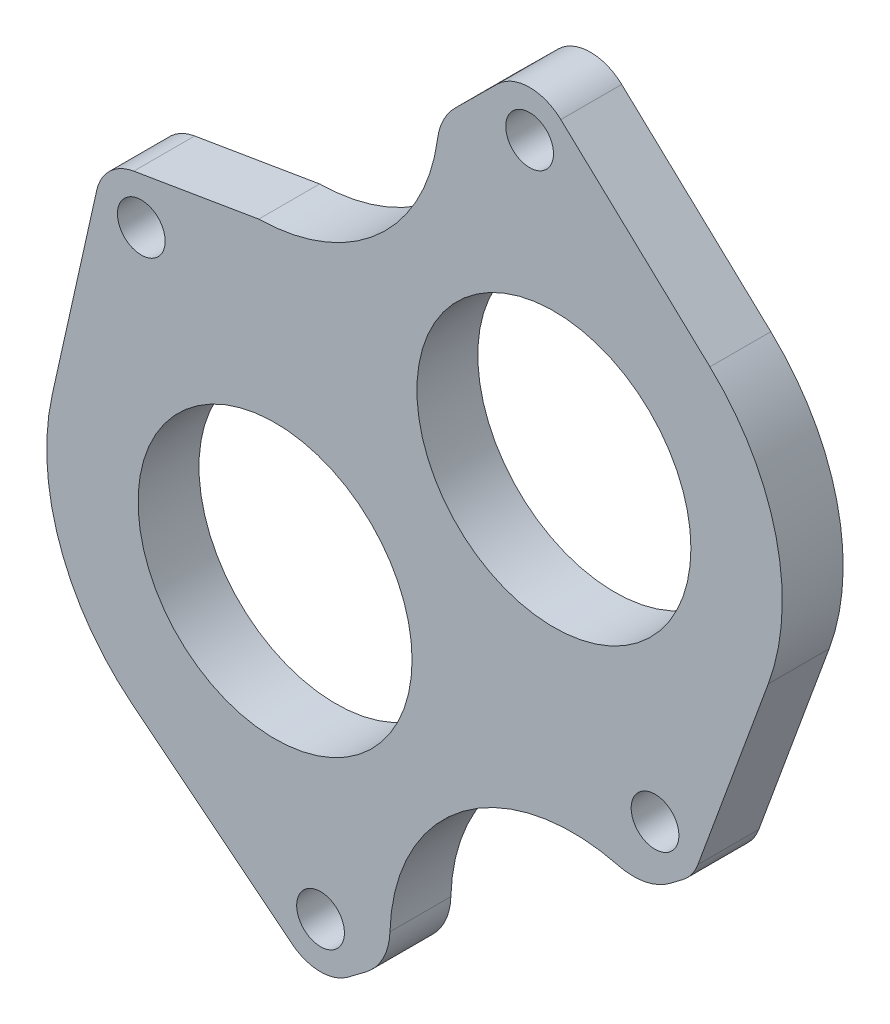
ISO-10303-21;
HEADER;
FILE_DESCRIPTION(('STEP AP214'),'2;1');
FILE_NAME('part.step','',(''),(''),'','','');
FILE_SCHEMA(('AUTOMOTIVE_DESIGN { 1 0 10303 214 1 1 1 1 }'));
ENDSEC;
DATA;
#1=APPLICATION_CONTEXT('core data for automotive mechanical design processes');
#2=APPLICATION_PROTOCOL_DEFINITION('international standard','automotive_design',2000,#1);
#3=PRODUCT_CONTEXT('',#1,'mechanical');
#4=PRODUCT('Part','Part','',(#3));
#5=PRODUCT_RELATED_PRODUCT_CATEGORY('part','',(#4));
#6=PRODUCT_DEFINITION_FORMATION('','',#4);
#7=PRODUCT_DEFINITION_CONTEXT('part definition',#1,'design');
#8=PRODUCT_DEFINITION('design','',#6,#7);
#9=PRODUCT_DEFINITION_SHAPE('','',#8);
#10=(LENGTH_UNIT() NAMED_UNIT(*) SI_UNIT(.MILLI.,.METRE.));
#11=(NAMED_UNIT(*) PLANE_ANGLE_UNIT() SI_UNIT($,.RADIAN.));
#12=(NAMED_UNIT(*) SI_UNIT($,.STERADIAN.) SOLID_ANGLE_UNIT());
#13=UNCERTAINTY_MEASURE_WITH_UNIT(LENGTH_MEASURE(1.E-05),#10,'distance_accuracy_value','');
#14=(GEOMETRIC_REPRESENTATION_CONTEXT(3) GLOBAL_UNCERTAINTY_ASSIGNED_CONTEXT((#13)) GLOBAL_UNIT_ASSIGNED_CONTEXT((#10,
#11,#12)) REPRESENTATION_CONTEXT('',''));
#15=CARTESIAN_POINT('',(0.,0.,0.));
#16=DIRECTION('',(0.,0.,1.));
#17=DIRECTION('',(1.,0.,0.));
#18=AXIS2_PLACEMENT_3D('',#15,#16,#17);
#19=CARTESIAN_POINT('',(363.409853814933,255.603713269691,6.35));
#20=DIRECTION('',(0.,0.,1.));
#21=DIRECTION('',(1.,0.,0.));
#22=AXIS2_PLACEMENT_3D('',#19,#20,#21);
#23=PLANE('',#22);
#24=CARTESIAN_POINT('',(339.073186785204,202.806598082301,6.35));
#25=DIRECTION('',(0.,0.,1.));
#26=DIRECTION('',(1.,0.,0.));
#27=AXIS2_PLACEMENT_3D('',#24,#25,#26);
#28=CIRCLE('',#27,2.48920000000001);
#29=CARTESIAN_POINT('',(341.562386785204,202.806598082301,6.35));
#30=VERTEX_POINT('',#29);
#31=EDGE_CURVE('E351',#30,#30,#28,.T.);
#32=ORIENTED_EDGE('',*,*,#31,.F.);
#33=EDGE_LOOP('',(#32));
#34=FACE_BOUND('',#33,.T.);
#35=CARTESIAN_POINT('',(360.875584674336,284.066111357747,6.35));
#36=DIRECTION('',(0.,0.,1.));
#37=DIRECTION('',(1.,0.,0.));
#38=AXIS2_PLACEMENT_3D('',#35,#36,#37);
#39=CIRCLE('',#38,2.48920000000001);
#40=CARTESIAN_POINT('',(363.364784674336,284.066111357747,6.35));
#41=VERTEX_POINT('',#40);
#42=EDGE_CURVE('E339',#41,#41,#39,.T.);
#43=ORIENTED_EDGE('',*,*,#42,.F.);
#44=EDGE_LOOP('',(#43));
#45=FACE_BOUND('',#44,.T.);
#46=CARTESIAN_POINT('',(320.381847871192,255.924118881008,6.35));
#47=DIRECTION('',(0.,0.,1.));
#48=DIRECTION('',(1.,0.,0.));
#49=AXIS2_PLACEMENT_3D('',#46,#47,#48);
#50=CIRCLE('',#49,2.48920000000001);
#51=CARTESIAN_POINT('',(322.871047871192,255.924118881008,6.35));
#52=VERTEX_POINT('',#51);
#53=EDGE_CURVE('E305',#52,#52,#50,.T.);
#54=ORIENTED_EDGE('',*,*,#53,.F.);
#55=EDGE_LOOP('',(#54));
#56=FACE_BOUND('',#55,.T.);
#57=CARTESIAN_POINT('',(365.35511748156,204.733869501161,6.35));
#58=DIRECTION('',(0.,0.,-1.));
#59=DIRECTION('',(-1.,0.,0.));
#60=AXIS2_PLACEMENT_3D('',#57,#58,#59);
#61=CIRCLE('',#60,19.05);
#62=CARTESIAN_POINT('',(346.312999091938,205.281799456218,6.35));
#63=VERTEX_POINT('',#62);
#64=CARTESIAN_POINT('',(370.108013128838,223.18142985385,6.35));
#65=VERTEX_POINT('',#64);
#66=EDGE_CURVE('E311',#63,#65,#61,.T.);
#67=ORIENTED_EDGE('',*,*,#66,.T.);
#68=CARTESIAN_POINT('',(371.692311677931,229.330616638079,6.35));
#69=DIRECTION('',(0.,0.,1.));
#70=DIRECTION('',(1.,0.,0.));
#71=AXIS2_PLACEMENT_3D('',#68,#69,#70);
#72=CIRCLE('',#71,6.35);
#73=CARTESIAN_POINT('',(375.509592032349,224.256085064054,6.35));
#74=VERTEX_POINT('',#73);
#75=EDGE_CURVE('E217',#65,#74,#72,.T.);
#76=ORIENTED_EDGE('',*,*,#75,.T.);
#77=DIRECTION('',(0.799138830555082,0.601146512506773,0.));
#78=VECTOR('',#77,1.);
#79=CARTESIAN_POINT('',(376.816438514688,225.239151053595,6.35));
#80=LINE('',#79,#78);
#81=CARTESIAN_POINT('',(376.816438514688,225.239151053595,6.35));
#82=VERTEX_POINT('',#81);
#83=EDGE_CURVE('E309',#74,#82,#80,.T.);
#84=ORIENTED_EDGE('',*,*,#83,.T.);
#85=CARTESIAN_POINT('',(373.953478248874,229.045049734113,6.35));
#86=DIRECTION('',(0.,0.,1.));
#87=DIRECTION('',(-1.,0.,0.));
#88=AXIS2_PLACEMENT_3D('',#85,#86,#87);
#89=CIRCLE('',#88,4.76249999999999);
#90=CARTESIAN_POINT('',(378.42426857804,227.4038793948,6.35));
#91=VERTEX_POINT('',#90);
#92=EDGE_CURVE('E307',#82,#91,#89,.T.);
#93=ORIENTED_EDGE('',*,*,#92,.T.);
#94=DIRECTION('',(0.344602695918755,0.938748625546544,0.));
#95=VECTOR('',#94,1.);
#96=CARTESIAN_POINT('',(378.42426857804,227.4038793948,6.35));
#97=LINE('',#96,#95);
#98=CARTESIAN_POINT('',(385.76380546076,247.397861573125,6.35));
#99=VERTEX_POINT('',#98);
#100=EDGE_CURVE('E186',#91,#99,#97,.T.);
#101=ORIENTED_EDGE('',*,*,#100,.T.);
#102=CARTESIAN_POINT('',(363.409853814933,255.603713269691,6.35));
#103=DIRECTION('',(0.,0.,1.));
#104=DIRECTION('',(1.,0.,0.));
#105=AXIS2_PLACEMENT_3D('',#102,#103,#104);
#106=CIRCLE('',#105,23.8125000000001);
#107=CARTESIAN_POINT('',(379.680775661145,272.990267227404,6.35));
#108=VERTEX_POINT('',#107);
#109=EDGE_CURVE('E180',#99,#108,#106,.T.);
#110=ORIENTED_EDGE('',*,*,#109,.T.);
#111=DIRECTION('',(-0.730143998224189,0.683293305877641,0.));
#112=VECTOR('',#111,1.);
#113=CARTESIAN_POINT('',(379.680775661145,272.990267227404,6.35));
#114=LINE('',#113,#112);
#115=CARTESIAN_POINT('',(364.129769043579,287.54342214929,6.35));
#116=VERTEX_POINT('',#115);
#117=EDGE_CURVE('E170',#108,#116,#114,.T.);
#118=ORIENTED_EDGE('',*,*,#117,.T.);
#119=CARTESIAN_POINT('',(360.875584674336,284.066111357747,6.35));
#120=DIRECTION('',(0.,0.,1.));
#121=DIRECTION('',(1.,0.,0.));
#122=AXIS2_PLACEMENT_3D('',#119,#120,#121);
#123=CIRCLE('',#122,4.76250000000002);
#124=CARTESIAN_POINT('',(357.525140617793,287.450772474311,6.35));
#125=VERTEX_POINT('',#124);
#126=EDGE_CURVE('E179',#116,#125,#123,.T.);
#127=ORIENTED_EDGE('',*,*,#126,.T.);
#128=DIRECTION('',(-0.71068999822854,-0.703505313709795,0.));
#129=VECTOR('',#128,1.);
#130=CARTESIAN_POINT('',(357.525140617793,287.450772474311,6.35));
#131=LINE('',#130,#129);
#132=CARTESIAN_POINT('',(353.104578853054,283.074900154695,6.35));
#133=VERTEX_POINT('',#132);
#134=EDGE_CURVE('E298',#125,#133,#131,.T.);
#135=ORIENTED_EDGE('',*,*,#134,.T.);
#136=CARTESIAN_POINT('',(357.571837595111,278.562018665943,6.35));
#137=DIRECTION('',(0.,0.,1.));
#138=DIRECTION('',(1.,0.,0.));
#139=AXIS2_PLACEMENT_3D('',#136,#137,#138);
#140=CIRCLE('',#139,6.35);
#141=CARTESIAN_POINT('',(351.275437757818,279.385334576715,6.35));
#142=VERTEX_POINT('',#141);
#143=EDGE_CURVE('E60',#133,#142,#140,.T.);
#144=ORIENTED_EDGE('',*,*,#143,.T.);
#145=CARTESIAN_POINT('',(332.386238245937,281.855282309029,6.35));
#146=DIRECTION('',(0.,0.,-1.));
#147=DIRECTION('',(1.,0.,0.));
#148=AXIS2_PLACEMENT_3D('',#145,#146,#147);
#149=CIRCLE('',#148,19.05);
#150=CARTESIAN_POINT('',(332.629523008417,262.806835849426,6.35));
#151=VERTEX_POINT('',#150);
#152=EDGE_CURVE('E227',#142,#151,#149,.T.);
#153=ORIENTED_EDGE('',*,*,#152,.T.);
#154=DIRECTION('',(-0.98623091005771,-0.165374097266594,0.));
#155=VECTOR('',#154,1.);
#156=CARTESIAN_POINT('',(319.59425373296,260.621043590157,6.35));
#157=LINE('',#156,#155);
#158=CARTESIAN_POINT('',(319.59425373296,260.621043590157,6.35));
#159=VERTEX_POINT('',#158);
#160=EDGE_CURVE('E325',#151,#159,#157,.T.);
#161=ORIENTED_EDGE('',*,*,#160,.T.);
#162=CARTESIAN_POINT('',(320.381847871192,255.924118881008,6.35));
#163=DIRECTION('',(0.,0.,1.));
#164=DIRECTION('',(1.,0.,0.));
#165=AXIS2_PLACEMENT_3D('',#162,#163,#164);
#166=CIRCLE('',#165,4.76249999999999);
#167=CARTESIAN_POINT('',(315.733853838234,256.96217365778,6.35));
#168=VERTEX_POINT('',#167);
#169=EDGE_CURVE('E323',#159,#168,#166,.T.);
#170=ORIENTED_EDGE('',*,*,#169,.T.);
#171=DIRECTION('',(-0.217964257590044,-0.975956752327285,0.));
#172=VECTOR('',#171,1.);
#173=CARTESIAN_POINT('',(311.09153174777,236.175712424362,6.35));
#174=LINE('',#173,#172);
#175=CARTESIAN_POINT('',(311.09153174777,236.175712424362,6.35));
#176=VERTEX_POINT('',#175);
#177=EDGE_CURVE('E321',#168,#176,#174,.T.);
#178=ORIENTED_EDGE('',*,*,#177,.T.);
#179=CARTESIAN_POINT('',(334.331501912563,230.985438540499,6.35));
#180=DIRECTION('',(0.,0.,1.));
#181=DIRECTION('',(1.,0.,0.));
#182=AXIS2_PLACEMENT_3D('',#179,#180,#181);
#183=CIRCLE('',#182,23.8125);
#184=CARTESIAN_POINT('',(319.463048288572,212.385324479526,6.35));
#185=VERTEX_POINT('',#184);
#186=EDGE_CURVE('E319',#176,#185,#183,.T.);
#187=ORIENTED_EDGE('',*,*,#186,.T.);
#188=DIRECTION('',(0.781107152166841,-0.624397002582337,0.));
#189=VECTOR('',#188,1.);
#190=CARTESIAN_POINT('',(336.099496060406,199.086575270107,6.35));
#191=LINE('',#190,#189);
#192=CARTESIAN_POINT('',(336.099496060406,199.086575270107,6.35));
#193=VERTEX_POINT('',#192);
#194=EDGE_CURVE('E317',#185,#193,#191,.T.);
#195=ORIENTED_EDGE('',*,*,#194,.T.);
#196=CARTESIAN_POINT('',(339.073186785204,202.806598082301,6.35));
#197=DIRECTION('',(0.,0.,1.));
#198=DIRECTION('',(1.,0.,0.));
#199=AXIS2_PLACEMENT_3D('',#196,#197,#198);
#200=CIRCLE('',#199,4.76249999999999);
#201=CARTESIAN_POINT('',(341.936147051017,199.000699401783,6.35));
#202=VERTEX_POINT('',#201);
#203=EDGE_CURVE('E315',#193,#202,#200,.T.);
#204=ORIENTED_EDGE('',*,*,#203,.T.);
#205=DIRECTION('',(0.799138830555082,0.601146512506773,0.));
#206=VECTOR('',#205,1.);
#207=CARTESIAN_POINT('',(346.449167736349,202.39558717613,6.35));
#208=LINE('',#207,#206);
#209=CARTESIAN_POINT('',(343.782906649816,200.389911200545,6.35));
#210=VERTEX_POINT('',#209);
#211=EDGE_CURVE('E313',#202,#210,#208,.T.);
#212=ORIENTED_EDGE('',*,*,#211,.T.);
#213=CARTESIAN_POINT('',(339.965626295398,205.46444277457,6.35));
#214=DIRECTION('',(0.,0.,1.));
#215=DIRECTION('',(1.,0.,0.));
#216=AXIS2_PLACEMENT_3D('',#213,#214,#215);
#217=CIRCLE('',#216,6.35);
#218=EDGE_CURVE('E215',#210,#63,#217,.T.);
#219=ORIENTED_EDGE('',*,*,#218,.T.);
#220=EDGE_LOOP('',(#67,#76,#84,#93,#101,#110,#118,#127,#135,#144,#153,#161,#170,#178,#187,#195,
#204,#212,#219));
#221=FACE_BOUND('',#220,.T.);
#222=CARTESIAN_POINT('',(363.409853814933,255.603713269691,6.35));
#223=DIRECTION('',(0.,0.,1.));
#224=DIRECTION('',(1.,0.,0.));
#225=AXIS2_PLACEMENT_3D('',#222,#223,#224);
#226=CIRCLE('',#225,14.2875);
#227=CARTESIAN_POINT('',(377.697353814933,255.603713269691,6.35));
#228=VERTEX_POINT('',#227);
#229=EDGE_CURVE('E333',#228,#228,#226,.T.);
#230=ORIENTED_EDGE('',*,*,#229,.F.);
#231=EDGE_LOOP('',(#230));
#232=FACE_BOUND('',#231,.T.);
#233=CARTESIAN_POINT('',(373.953478248874,229.045049734113,6.35));
#234=DIRECTION('',(0.,0.,1.));
#235=DIRECTION('',(1.,0.,0.));
#236=AXIS2_PLACEMENT_3D('',#233,#234,#235);
#237=CIRCLE('',#236,2.48920000000001);
#238=CARTESIAN_POINT('',(376.442678248874,229.045049734113,6.35));
#239=VERTEX_POINT('',#238);
#240=EDGE_CURVE('E345',#239,#239,#237,.T.);
#241=ORIENTED_EDGE('',*,*,#240,.F.);
#242=EDGE_LOOP('',(#241));
#243=FACE_BOUND('',#242,.T.);
#244=CARTESIAN_POINT('',(334.331501912563,230.985438540499,6.35));
#245=DIRECTION('',(0.,0.,1.));
#246=DIRECTION('',(1.,0.,0.));
#247=AXIS2_PLACEMENT_3D('',#244,#245,#246);
#248=CIRCLE('',#247,14.2875);
#249=CARTESIAN_POINT('',(348.619001912563,230.985438540499,6.35));
#250=VERTEX_POINT('',#249);
#251=EDGE_CURVE('E357',#250,#250,#248,.T.);
#252=ORIENTED_EDGE('',*,*,#251,.F.);
#253=EDGE_LOOP('',(#252));
#254=FACE_BOUND('',#253,.T.);
#255=ADVANCED_FACE('F37',(#34,#45,#56,#221,#232,#243,#254),#23,.T.);
#256=CARTESIAN_POINT('',(363.409853814933,255.603713269691,0.));
#257=DIRECTION('',(0.,0.,1.));
#258=DIRECTION('',(1.,0.,0.));
#259=AXIS2_PLACEMENT_3D('',#256,#257,#258);
#260=PLANE('',#259);
#261=DIRECTION('',(0.799138830555082,0.601146512506773,0.));
#262=VECTOR('',#261,1.);
#263=CARTESIAN_POINT('',(376.816438514688,225.239151053595,0.));
#264=LINE('',#263,#262);
#265=CARTESIAN_POINT('',(375.509592032349,224.256085064054,0.));
#266=VERTEX_POINT('',#265);
#267=CARTESIAN_POINT('',(376.816438514688,225.239151053595,0.));
#268=VERTEX_POINT('',#267);
#269=EDGE_CURVE('E260',#266,#268,#264,.T.);
#270=ORIENTED_EDGE('',*,*,#269,.F.);
#271=CARTESIAN_POINT('',(371.692311677931,229.330616638079,0.));
#272=DIRECTION('',(0.,0.,1.));
#273=DIRECTION('',(1.,0.,0.));
#274=AXIS2_PLACEMENT_3D('',#271,#272,#273);
#275=CIRCLE('',#274,6.35);
#276=CARTESIAN_POINT('',(370.108013128838,223.18142985385,0.));
#277=VERTEX_POINT('',#276);
#278=EDGE_CURVE('E207',#266,#277,#275,.F.);
#279=ORIENTED_EDGE('',*,*,#278,.T.);
#280=CARTESIAN_POINT('',(365.35511748156,204.733869501161,0.));
#281=DIRECTION('',(0.,0.,-1.));
#282=DIRECTION('',(-1.,0.,0.));
#283=AXIS2_PLACEMENT_3D('',#280,#281,#282);
#284=CIRCLE('',#283,19.05);
#285=CARTESIAN_POINT('',(346.312999091938,205.281799456218,0.));
#286=VERTEX_POINT('',#285);
#287=EDGE_CURVE('E257',#286,#277,#284,.T.);
#288=ORIENTED_EDGE('',*,*,#287,.F.);
#289=CARTESIAN_POINT('',(339.965626295398,205.46444277457,0.));
#290=DIRECTION('',(0.,0.,1.));
#291=DIRECTION('',(1.,0.,0.));
#292=AXIS2_PLACEMENT_3D('',#289,#290,#291);
#293=CIRCLE('',#292,6.35);
#294=CARTESIAN_POINT('',(343.782906649816,200.389911200545,0.));
#295=VERTEX_POINT('',#294);
#296=EDGE_CURVE('E205',#286,#295,#293,.F.);
#297=ORIENTED_EDGE('',*,*,#296,.T.);
#298=DIRECTION('',(0.799138830555082,0.601146512506773,0.));
#299=VECTOR('',#298,1.);
#300=CARTESIAN_POINT('',(346.449167736349,202.39558717613,0.));
#301=LINE('',#300,#299);
#302=CARTESIAN_POINT('',(341.936147051017,199.000699401783,0.));
#303=VERTEX_POINT('',#302);
#304=EDGE_CURVE('E255',#303,#295,#301,.T.);
#305=ORIENTED_EDGE('',*,*,#304,.F.);
#306=CARTESIAN_POINT('',(339.073186785204,202.806598082301,0.));
#307=DIRECTION('',(0.,0.,1.));
#308=DIRECTION('',(1.,0.,0.));
#309=AXIS2_PLACEMENT_3D('',#306,#307,#308);
#310=CIRCLE('',#309,4.76249999999999);
#311=CARTESIAN_POINT('',(336.099496060406,199.086575270107,0.));
#312=VERTEX_POINT('',#311);
#313=EDGE_CURVE('E253',#312,#303,#310,.T.);
#314=ORIENTED_EDGE('',*,*,#313,.F.);
#315=DIRECTION('',(0.781107152166841,-0.624397002582337,0.));
#316=VECTOR('',#315,1.);
#317=CARTESIAN_POINT('',(336.099496060406,199.086575270107,0.));
#318=LINE('',#317,#316);
#319=CARTESIAN_POINT('',(319.463048288572,212.385324479526,0.));
#320=VERTEX_POINT('',#319);
#321=EDGE_CURVE('E251',#320,#312,#318,.T.);
#322=ORIENTED_EDGE('',*,*,#321,.F.);
#323=CARTESIAN_POINT('',(334.331501912563,230.985438540499,0.));
#324=DIRECTION('',(0.,0.,1.));
#325=DIRECTION('',(1.,0.,0.));
#326=AXIS2_PLACEMENT_3D('',#323,#324,#325);
#327=CIRCLE('',#326,23.8125);
#328=CARTESIAN_POINT('',(311.09153174777,236.175712424362,0.));
#329=VERTEX_POINT('',#328);
#330=EDGE_CURVE('E249',#329,#320,#327,.T.);
#331=ORIENTED_EDGE('',*,*,#330,.F.);
#332=DIRECTION('',(-0.217964257590044,-0.975956752327285,0.));
#333=VECTOR('',#332,1.);
#334=CARTESIAN_POINT('',(311.09153174777,236.175712424362,0.));
#335=LINE('',#334,#333);
#336=CARTESIAN_POINT('',(315.733853838234,256.96217365778,0.));
#337=VERTEX_POINT('',#336);
#338=EDGE_CURVE('E247',#337,#329,#335,.T.);
#339=ORIENTED_EDGE('',*,*,#338,.F.);
#340=CARTESIAN_POINT('',(320.381847871192,255.924118881008,0.));
#341=DIRECTION('',(0.,0.,1.));
#342=DIRECTION('',(1.,0.,0.));
#343=AXIS2_PLACEMENT_3D('',#340,#341,#342);
#344=CIRCLE('',#343,4.76249999999999);
#345=CARTESIAN_POINT('',(319.59425373296,260.621043590157,0.));
#346=VERTEX_POINT('',#345);
#347=EDGE_CURVE('E240',#346,#337,#344,.T.);
#348=ORIENTED_EDGE('',*,*,#347,.F.);
#349=DIRECTION('',(-0.98623091005771,-0.165374097266594,0.));
#350=VECTOR('',#349,1.);
#351=CARTESIAN_POINT('',(319.59425373296,260.621043590157,0.));
#352=LINE('',#351,#350);
#353=CARTESIAN_POINT('',(332.629523008417,262.806835849426,0.));
#354=VERTEX_POINT('',#353);
#355=EDGE_CURVE('E237',#354,#346,#352,.T.);
#356=ORIENTED_EDGE('',*,*,#355,.F.);
#357=CARTESIAN_POINT('',(332.386238245937,281.855282309029,0.));
#358=DIRECTION('',(0.,0.,-1.));
#359=DIRECTION('',(1.,0.,0.));
#360=AXIS2_PLACEMENT_3D('',#357,#358,#359);
#361=CIRCLE('',#360,19.05);
#362=CARTESIAN_POINT('',(351.275437757818,279.385334576715,0.));
#363=VERTEX_POINT('',#362);
#364=EDGE_CURVE('E225',#363,#354,#361,.T.);
#365=ORIENTED_EDGE('',*,*,#364,.F.);
#366=CARTESIAN_POINT('',(357.571837595111,278.562018665943,0.));
#367=DIRECTION('',(0.,0.,1.));
#368=DIRECTION('',(1.,0.,0.));
#369=AXIS2_PLACEMENT_3D('',#366,#367,#368);
#370=CIRCLE('',#369,6.35);
#371=CARTESIAN_POINT('',(353.104578853054,283.074900154695,0.));
#372=VERTEX_POINT('',#371);
#373=EDGE_CURVE('E198',#363,#372,#370,.F.);
#374=ORIENTED_EDGE('',*,*,#373,.T.);
#375=DIRECTION('',(-0.71068999822854,-0.703505313709795,0.));
#376=VECTOR('',#375,1.);
#377=CARTESIAN_POINT('',(357.525140617793,287.450772474311,0.));
#378=LINE('',#377,#376);
#379=CARTESIAN_POINT('',(357.525140617793,287.450772474311,0.));
#380=VERTEX_POINT('',#379);
#381=EDGE_CURVE('E238',#380,#372,#378,.T.);
#382=ORIENTED_EDGE('',*,*,#381,.F.);
#383=CARTESIAN_POINT('',(360.875584674336,284.066111357747,0.));
#384=DIRECTION('',(0.,0.,1.));
#385=DIRECTION('',(1.,0.,0.));
#386=AXIS2_PLACEMENT_3D('',#383,#384,#385);
#387=CIRCLE('',#386,4.76250000000002);
#388=CARTESIAN_POINT('',(364.129769043579,287.54342214929,0.));
#389=VERTEX_POINT('',#388);
#390=EDGE_CURVE('E242',#389,#380,#387,.T.);
#391=ORIENTED_EDGE('',*,*,#390,.F.);
#392=DIRECTION('',(-0.730143998224189,0.683293305877641,0.));
#393=VECTOR('',#392,1.);
#394=CARTESIAN_POINT('',(379.680775661145,272.990267227404,0.));
#395=LINE('',#394,#393);
#396=CARTESIAN_POINT('',(379.680775661145,272.990267227404,0.));
#397=VERTEX_POINT('',#396);
#398=EDGE_CURVE('E301',#397,#389,#395,.T.);
#399=ORIENTED_EDGE('',*,*,#398,.F.);
#400=CARTESIAN_POINT('',(363.409853814933,255.603713269691,0.));
#401=DIRECTION('',(0.,0.,1.));
#402=DIRECTION('',(1.,0.,0.));
#403=AXIS2_PLACEMENT_3D('',#400,#401,#402);
#404=CIRCLE('',#403,23.8125000000001);
#405=CARTESIAN_POINT('',(385.76380546076,247.397861573125,0.));
#406=VERTEX_POINT('',#405);
#407=EDGE_CURVE('E194',#406,#397,#404,.T.);
#408=ORIENTED_EDGE('',*,*,#407,.F.);
#409=DIRECTION('',(0.344602695918755,0.938748625546544,0.));
#410=VECTOR('',#409,1.);
#411=CARTESIAN_POINT('',(378.42426857804,227.4038793948,0.));
#412=LINE('',#411,#410);
#413=CARTESIAN_POINT('',(378.42426857804,227.4038793948,0.));
#414=VERTEX_POINT('',#413);
#415=EDGE_CURVE('E190',#414,#406,#412,.T.);
#416=ORIENTED_EDGE('',*,*,#415,.F.);
#417=CARTESIAN_POINT('',(373.953478248874,229.045049734113,0.));
#418=DIRECTION('',(0.,0.,1.));
#419=DIRECTION('',(-1.,0.,0.));
#420=AXIS2_PLACEMENT_3D('',#417,#418,#419);
#421=CIRCLE('',#420,4.76249999999999);
#422=EDGE_CURVE('E262',#268,#414,#421,.T.);
#423=ORIENTED_EDGE('',*,*,#422,.F.);
#424=EDGE_LOOP('',(#270,#279,#288,#297,#305,#314,#322,#331,#339,#348,#356,#365,#374,#382,#391,
#399,#408,#416,#423));
#425=FACE_BOUND('',#424,.T.);
#426=CARTESIAN_POINT('',(320.381847871192,255.924118881008,0.));
#427=DIRECTION('',(0.,0.,1.));
#428=DIRECTION('',(1.,0.,0.));
#429=AXIS2_PLACEMENT_3D('',#426,#427,#428);
#430=CIRCLE('',#429,2.48920000000001);
#431=CARTESIAN_POINT('',(322.871047871192,255.924118881008,0.));
#432=VERTEX_POINT('',#431);
#433=EDGE_CURVE('E330',#432,#432,#430,.T.);
#434=ORIENTED_EDGE('',*,*,#433,.T.);
#435=EDGE_LOOP('',(#434));
#436=FACE_BOUND('',#435,.T.);
#437=CARTESIAN_POINT('',(363.409853814933,255.603713269691,0.));
#438=DIRECTION('',(0.,0.,1.));
#439=DIRECTION('',(1.,0.,0.));
#440=AXIS2_PLACEMENT_3D('',#437,#438,#439);
#441=CIRCLE('',#440,14.2875);
#442=CARTESIAN_POINT('',(377.697353814933,255.603713269691,0.));
#443=VERTEX_POINT('',#442);
#444=EDGE_CURVE('E336',#443,#443,#441,.T.);
#445=ORIENTED_EDGE('',*,*,#444,.T.);
#446=EDGE_LOOP('',(#445));
#447=FACE_BOUND('',#446,.T.);
#448=CARTESIAN_POINT('',(360.875584674336,284.066111357747,0.));
#449=DIRECTION('',(0.,0.,1.));
#450=DIRECTION('',(1.,0.,0.));
#451=AXIS2_PLACEMENT_3D('',#448,#449,#450);
#452=CIRCLE('',#451,2.48920000000001);
#453=CARTESIAN_POINT('',(363.364784674336,284.066111357747,0.));
#454=VERTEX_POINT('',#453);
#455=EDGE_CURVE('E342',#454,#454,#452,.T.);
#456=ORIENTED_EDGE('',*,*,#455,.T.);
#457=EDGE_LOOP('',(#456));
#458=FACE_BOUND('',#457,.T.);
#459=CARTESIAN_POINT('',(373.953478248874,229.045049734113,0.));
#460=DIRECTION('',(0.,0.,1.));
#461=DIRECTION('',(1.,0.,0.));
#462=AXIS2_PLACEMENT_3D('',#459,#460,#461);
#463=CIRCLE('',#462,2.48920000000001);
#464=CARTESIAN_POINT('',(376.442678248874,229.045049734113,0.));
#465=VERTEX_POINT('',#464);
#466=EDGE_CURVE('E348',#465,#465,#463,.T.);
#467=ORIENTED_EDGE('',*,*,#466,.T.);
#468=EDGE_LOOP('',(#467));
#469=FACE_BOUND('',#468,.T.);
#470=CARTESIAN_POINT('',(339.073186785204,202.806598082301,0.));
#471=DIRECTION('',(0.,0.,1.));
#472=DIRECTION('',(1.,0.,0.));
#473=AXIS2_PLACEMENT_3D('',#470,#471,#472);
#474=CIRCLE('',#473,2.48920000000001);
#475=CARTESIAN_POINT('',(341.562386785204,202.806598082301,0.));
#476=VERTEX_POINT('',#475);
#477=EDGE_CURVE('E354',#476,#476,#474,.T.);
#478=ORIENTED_EDGE('',*,*,#477,.T.);
#479=EDGE_LOOP('',(#478));
#480=FACE_BOUND('',#479,.T.);
#481=CARTESIAN_POINT('',(334.331501912563,230.985438540499,0.));
#482=DIRECTION('',(0.,0.,1.));
#483=DIRECTION('',(1.,0.,0.));
#484=AXIS2_PLACEMENT_3D('',#481,#482,#483);
#485=CIRCLE('',#484,14.2875);
#486=CARTESIAN_POINT('',(348.619001912563,230.985438540499,0.));
#487=VERTEX_POINT('',#486);
#488=EDGE_CURVE('E360',#487,#487,#485,.T.);
#489=ORIENTED_EDGE('',*,*,#488,.T.);
#490=EDGE_LOOP('',(#489));
#491=FACE_BOUND('',#490,.T.);
#492=ADVANCED_FACE('F232',(#425,#436,#447,#458,#469,#480,#491),#260,.F.);
#493=CARTESIAN_POINT('',(363.409853814933,255.603713269691,6.35));
#494=DIRECTION('',(0.,0.,-1.));
#495=DIRECTION('',(-1.,0.,0.));
#496=AXIS2_PLACEMENT_3D('',#493,#494,#495);
#497=CYLINDRICAL_SURFACE('',#496,23.8125000000001);
#498=ORIENTED_EDGE('',*,*,#407,.T.);
#499=DIRECTION('',(0.,0.,-1.));
#500=VECTOR('',#499,1.);
#501=CARTESIAN_POINT('',(379.680775661145,272.990267227404,6.35));
#502=LINE('',#501,#500);
#503=EDGE_CURVE('E174',#108,#397,#502,.T.);
#504=ORIENTED_EDGE('',*,*,#503,.F.);
#505=ORIENTED_EDGE('',*,*,#109,.F.);
#506=DIRECTION('',(0.,0.,-1.));
#507=VECTOR('',#506,1.);
#508=CARTESIAN_POINT('',(385.76380546076,247.397861573125,6.35));
#509=LINE('',#508,#507);
#510=EDGE_CURVE('E265',#99,#406,#509,.T.);
#511=ORIENTED_EDGE('',*,*,#510,.T.);
#512=EDGE_LOOP('',(#498,#504,#505,#511));
#513=FACE_BOUND('',#512,.T.);
#514=ADVANCED_FACE('F192',(#513),#497,.T.);
#515=CARTESIAN_POINT('',(379.680775661145,272.990267227404,6.35));
#516=DIRECTION('',(-0.683293305877641,-0.730143998224189,0.));
#517=DIRECTION('',(0.730143998224189,-0.683293305877642,0.));
#518=AXIS2_PLACEMENT_3D('',#515,#516,#517);
#519=PLANE('',#518);
#520=ORIENTED_EDGE('',*,*,#398,.T.);
#521=DIRECTION('',(0.,0.,-1.));
#522=VECTOR('',#521,1.);
#523=CARTESIAN_POINT('',(364.129769043579,287.54342214929,6.35));
#524=LINE('',#523,#522);
#525=EDGE_CURVE('E177',#116,#389,#524,.T.);
#526=ORIENTED_EDGE('',*,*,#525,.F.);
#527=ORIENTED_EDGE('',*,*,#117,.F.);
#528=ORIENTED_EDGE('',*,*,#503,.T.);
#529=EDGE_LOOP('',(#520,#526,#527,#528));
#530=FACE_BOUND('',#529,.T.);
#531=ADVANCED_FACE('F172',(#530),#519,.F.);
#532=CARTESIAN_POINT('',(360.875584674336,284.066111357747,6.35));
#533=DIRECTION('',(0.,0.,-1.));
#534=DIRECTION('',(-1.,0.,0.));
#535=AXIS2_PLACEMENT_3D('',#532,#533,#534);
#536=CYLINDRICAL_SURFACE('',#535,4.76250000000002);
#537=ORIENTED_EDGE('',*,*,#390,.T.);
#538=DIRECTION('',(0.,0.,-1.));
#539=VECTOR('',#538,1.);
#540=CARTESIAN_POINT('',(357.525140617793,287.450772474311,6.35));
#541=LINE('',#540,#539);
#542=EDGE_CURVE('E200',#125,#380,#541,.T.);
#543=ORIENTED_EDGE('',*,*,#542,.F.);
#544=ORIENTED_EDGE('',*,*,#126,.F.);
#545=ORIENTED_EDGE('',*,*,#525,.T.);
#546=EDGE_LOOP('',(#537,#543,#544,#545));
#547=FACE_BOUND('',#546,.T.);
#548=ADVANCED_FACE('F429',(#547),#536,.T.);
#549=CARTESIAN_POINT('',(357.525140617793,287.450772474311,6.35));
#550=DIRECTION('',(0.703505313709795,-0.71068999822854,0.));
#551=DIRECTION('',(0.71068999822854,0.703505313709795,0.));
#552=AXIS2_PLACEMENT_3D('',#549,#550,#551);
#553=PLANE('',#552);
#554=ORIENTED_EDGE('',*,*,#381,.T.);
#555=DIRECTION('',(0.,0.,-1.));
#556=VECTOR('',#555,1.);
#557=CARTESIAN_POINT('',(353.104578853054,283.074900154695,6.35));
#558=LINE('',#557,#556);
#559=EDGE_CURVE('E11',#372,#133,#558,.F.);
#560=ORIENTED_EDGE('',*,*,#559,.T.);
#561=ORIENTED_EDGE('',*,*,#134,.F.);
#562=ORIENTED_EDGE('',*,*,#542,.T.);
#563=EDGE_LOOP('',(#554,#560,#561,#562));
#564=FACE_BOUND('',#563,.T.);
#565=ADVANCED_FACE('F296',(#564),#553,.F.);
#566=CARTESIAN_POINT('',(332.386238245937,281.855282309029,6.35));
#567=DIRECTION('',(0.,0.,-1.));
#568=DIRECTION('',(-1.,0.,0.));
#569=AXIS2_PLACEMENT_3D('',#566,#567,#568);
#570=CYLINDRICAL_SURFACE('',#569,19.05);
#571=ORIENTED_EDGE('',*,*,#152,.F.);
#572=DIRECTION('',(0.,0.,-1.));
#573=VECTOR('',#572,1.);
#574=CARTESIAN_POINT('',(351.275437757818,279.385334576715,6.35));
#575=LINE('',#574,#573);
#576=EDGE_CURVE('E45',#142,#363,#575,.T.);
#577=ORIENTED_EDGE('',*,*,#576,.T.);
#578=ORIENTED_EDGE('',*,*,#364,.T.);
#579=DIRECTION('',(0.,0.,-1.));
#580=VECTOR('',#579,1.);
#581=CARTESIAN_POINT('',(332.629523008417,262.806835849426,6.35));
#582=LINE('',#581,#580);
#583=EDGE_CURVE('E291',#151,#354,#582,.T.);
#584=ORIENTED_EDGE('',*,*,#583,.F.);
#585=EDGE_LOOP('',(#571,#577,#578,#584));
#586=FACE_BOUND('',#585,.T.);
#587=ADVANCED_FACE('F223',(#586),#570,.F.);
#588=CARTESIAN_POINT('',(319.59425373296,260.621043590157,6.35));
#589=DIRECTION('',(0.165374097266594,-0.98623091005771,0.));
#590=DIRECTION('',(0.98623091005771,0.165374097266594,0.));
#591=AXIS2_PLACEMENT_3D('',#588,#589,#590);
#592=PLANE('',#591);
#593=ORIENTED_EDGE('',*,*,#355,.T.);
#594=DIRECTION('',(0.,0.,-1.));
#595=VECTOR('',#594,1.);
#596=CARTESIAN_POINT('',(319.59425373296,260.621043590157,6.35));
#597=LINE('',#596,#595);
#598=EDGE_CURVE('E288',#159,#346,#597,.T.);
#599=ORIENTED_EDGE('',*,*,#598,.F.);
#600=ORIENTED_EDGE('',*,*,#160,.F.);
#601=ORIENTED_EDGE('',*,*,#583,.T.);
#602=EDGE_LOOP('',(#593,#599,#600,#601));
#603=FACE_BOUND('',#602,.T.);
#604=ADVANCED_FACE('F420',(#603),#592,.F.);
#605=CARTESIAN_POINT('',(320.381847871192,255.924118881008,6.35));
#606=DIRECTION('',(0.,0.,-1.));
#607=DIRECTION('',(-1.,0.,0.));
#608=AXIS2_PLACEMENT_3D('',#605,#606,#607);
#609=CYLINDRICAL_SURFACE('',#608,4.76249999999999);
#610=ORIENTED_EDGE('',*,*,#347,.T.);
#611=DIRECTION('',(0.,0.,-1.));
#612=VECTOR('',#611,1.);
#613=CARTESIAN_POINT('',(315.733853838234,256.96217365778,6.35));
#614=LINE('',#613,#612);
#615=EDGE_CURVE('E285',#168,#337,#614,.T.);
#616=ORIENTED_EDGE('',*,*,#615,.F.);
#617=ORIENTED_EDGE('',*,*,#169,.F.);
#618=ORIENTED_EDGE('',*,*,#598,.T.);
#619=EDGE_LOOP('',(#610,#616,#617,#618));
#620=FACE_BOUND('',#619,.T.);
#621=ADVANCED_FACE('F416',(#620),#609,.T.);
#622=CARTESIAN_POINT('',(311.09153174777,236.175712424362,6.35));
#623=DIRECTION('',(0.975956752327285,-0.217964257590044,0.));
#624=DIRECTION('',(0.217964257590044,0.975956752327285,0.));
#625=AXIS2_PLACEMENT_3D('',#622,#623,#624);
#626=PLANE('',#625);
#627=ORIENTED_EDGE('',*,*,#338,.T.);
#628=DIRECTION('',(0.,0.,-1.));
#629=VECTOR('',#628,1.);
#630=CARTESIAN_POINT('',(311.09153174777,236.175712424362,6.35));
#631=LINE('',#630,#629);
#632=EDGE_CURVE('E282',#176,#329,#631,.T.);
#633=ORIENTED_EDGE('',*,*,#632,.F.);
#634=ORIENTED_EDGE('',*,*,#177,.F.);
#635=ORIENTED_EDGE('',*,*,#615,.T.);
#636=EDGE_LOOP('',(#627,#633,#634,#635));
#637=FACE_BOUND('',#636,.T.);
#638=ADVANCED_FACE('F412',(#637),#626,.F.);
#639=CARTESIAN_POINT('',(334.331501912563,230.985438540499,6.35));
#640=DIRECTION('',(0.,0.,-1.));
#641=DIRECTION('',(-1.,0.,0.));
#642=AXIS2_PLACEMENT_3D('',#639,#640,#641);
#643=CYLINDRICAL_SURFACE('',#642,23.8125);
#644=ORIENTED_EDGE('',*,*,#330,.T.);
#645=DIRECTION('',(0.,0.,-1.));
#646=VECTOR('',#645,1.);
#647=CARTESIAN_POINT('',(319.463048288572,212.385324479526,6.35));
#648=LINE('',#647,#646);
#649=EDGE_CURVE('E279',#185,#320,#648,.T.);
#650=ORIENTED_EDGE('',*,*,#649,.F.);
#651=ORIENTED_EDGE('',*,*,#186,.F.);
#652=ORIENTED_EDGE('',*,*,#632,.T.);
#653=EDGE_LOOP('',(#644,#650,#651,#652));
#654=FACE_BOUND('',#653,.T.);
#655=ADVANCED_FACE('F408',(#654),#643,.T.);
#656=CARTESIAN_POINT('',(336.099496060406,199.086575270107,6.35));
#657=DIRECTION('',(0.624397002582337,0.781107152166841,0.));
#658=DIRECTION('',(-0.781107152166841,0.624397002582337,0.));
#659=AXIS2_PLACEMENT_3D('',#656,#657,#658);
#660=PLANE('',#659);
#661=ORIENTED_EDGE('',*,*,#321,.T.);
#662=DIRECTION('',(0.,0.,-1.));
#663=VECTOR('',#662,1.);
#664=CARTESIAN_POINT('',(336.099496060406,199.086575270107,6.35));
#665=LINE('',#664,#663);
#666=EDGE_CURVE('E276',#193,#312,#665,.T.);
#667=ORIENTED_EDGE('',*,*,#666,.F.);
#668=ORIENTED_EDGE('',*,*,#194,.F.);
#669=ORIENTED_EDGE('',*,*,#649,.T.);
#670=EDGE_LOOP('',(#661,#667,#668,#669));
#671=FACE_BOUND('',#670,.T.);
#672=ADVANCED_FACE('F404',(#671),#660,.F.);
#673=CARTESIAN_POINT('',(339.073186785204,202.806598082301,6.35));
#674=DIRECTION('',(0.,0.,-1.));
#675=DIRECTION('',(-1.,0.,0.));
#676=AXIS2_PLACEMENT_3D('',#673,#674,#675);
#677=CYLINDRICAL_SURFACE('',#676,4.76249999999999);
#678=ORIENTED_EDGE('',*,*,#313,.T.);
#679=DIRECTION('',(0.,0.,-1.));
#680=VECTOR('',#679,1.);
#681=CARTESIAN_POINT('',(341.936147051017,199.000699401783,6.35));
#682=LINE('',#681,#680);
#683=EDGE_CURVE('E273',#202,#303,#682,.T.);
#684=ORIENTED_EDGE('',*,*,#683,.F.);
#685=ORIENTED_EDGE('',*,*,#203,.F.);
#686=ORIENTED_EDGE('',*,*,#666,.T.);
#687=EDGE_LOOP('',(#678,#684,#685,#686));
#688=FACE_BOUND('',#687,.T.);
#689=ADVANCED_FACE('F401',(#688),#677,.T.);
#690=CARTESIAN_POINT('',(346.449167736349,202.39558717613,6.35));
#691=DIRECTION('',(-0.601146512506773,0.799138830555082,0.));
#692=DIRECTION('',(-0.799138830555082,-0.601146512506773,0.));
#693=AXIS2_PLACEMENT_3D('',#690,#691,#692);
#694=PLANE('',#693);
#695=ORIENTED_EDGE('',*,*,#304,.T.);
#696=DIRECTION('',(0.,0.,-1.));
#697=VECTOR('',#696,1.);
#698=CARTESIAN_POINT('',(343.782906649816,200.389911200545,6.35));
#699=LINE('',#698,#697);
#700=EDGE_CURVE('E52',#295,#210,#699,.F.);
#701=ORIENTED_EDGE('',*,*,#700,.T.);
#702=ORIENTED_EDGE('',*,*,#211,.F.);
#703=ORIENTED_EDGE('',*,*,#683,.T.);
#704=EDGE_LOOP('',(#695,#701,#702,#703));
#705=FACE_BOUND('',#704,.T.);
#706=ADVANCED_FACE('F397',(#705),#694,.F.);
#707=CARTESIAN_POINT('',(365.35511748156,204.733869501161,6.35));
#708=DIRECTION('',(0.,0.,-1.));
#709=DIRECTION('',(-1.,0.,0.));
#710=AXIS2_PLACEMENT_3D('',#707,#708,#709);
#711=CYLINDRICAL_SURFACE('',#710,19.05);
#712=ORIENTED_EDGE('',*,*,#287,.T.);
#713=DIRECTION('',(0.,0.,-1.));
#714=VECTOR('',#713,1.);
#715=CARTESIAN_POINT('',(370.108013128838,223.18142985385,6.35));
#716=LINE('',#715,#714);
#717=EDGE_CURVE('E212',#277,#65,#716,.F.);
#718=ORIENTED_EDGE('',*,*,#717,.T.);
#719=ORIENTED_EDGE('',*,*,#66,.F.);
#720=DIRECTION('',(0.,0.,-1.));
#721=VECTOR('',#720,1.);
#722=CARTESIAN_POINT('',(346.312999091938,205.281799456218,6.35));
#723=LINE('',#722,#721);
#724=EDGE_CURVE('E209',#63,#286,#723,.T.);
#725=ORIENTED_EDGE('',*,*,#724,.T.);
#726=EDGE_LOOP('',(#712,#718,#719,#725));
#727=FACE_BOUND('',#726,.T.);
#728=ADVANCED_FACE('F393',(#727),#711,.F.);
#729=CARTESIAN_POINT('',(376.816438514688,225.239151053595,6.35));
#730=DIRECTION('',(-0.601146512506773,0.799138830555082,0.));
#731=DIRECTION('',(-0.799138830555082,-0.601146512506773,0.));
#732=AXIS2_PLACEMENT_3D('',#729,#730,#731);
#733=PLANE('',#732);
#734=ORIENTED_EDGE('',*,*,#83,.F.);
#735=DIRECTION('',(0.,0.,-1.));
#736=VECTOR('',#735,1.);
#737=CARTESIAN_POINT('',(375.509592032349,224.256085064054,6.35));
#738=LINE('',#737,#736);
#739=EDGE_CURVE('E195',#74,#266,#738,.T.);
#740=ORIENTED_EDGE('',*,*,#739,.T.);
#741=ORIENTED_EDGE('',*,*,#269,.T.);
#742=DIRECTION('',(0.,0.,-1.));
#743=VECTOR('',#742,1.);
#744=CARTESIAN_POINT('',(376.816438514688,225.239151053595,6.35));
#745=LINE('',#744,#743);
#746=EDGE_CURVE('E270',#82,#268,#745,.T.);
#747=ORIENTED_EDGE('',*,*,#746,.F.);
#748=EDGE_LOOP('',(#734,#740,#741,#747));
#749=FACE_BOUND('',#748,.T.);
#750=ADVANCED_FACE('F389',(#749),#733,.F.);
#751=CARTESIAN_POINT('',(373.953478248874,229.045049734113,6.35));
#752=DIRECTION('',(0.,0.,-1.));
#753=DIRECTION('',(-1.,0.,0.));
#754=AXIS2_PLACEMENT_3D('',#751,#752,#753);
#755=CYLINDRICAL_SURFACE('',#754,4.76249999999999);
#756=ORIENTED_EDGE('',*,*,#422,.T.);
#757=DIRECTION('',(0.,0.,-1.));
#758=VECTOR('',#757,1.);
#759=CARTESIAN_POINT('',(378.42426857804,227.4038793948,6.35));
#760=LINE('',#759,#758);
#761=EDGE_CURVE('E267',#91,#414,#760,.T.);
#762=ORIENTED_EDGE('',*,*,#761,.F.);
#763=ORIENTED_EDGE('',*,*,#92,.F.);
#764=ORIENTED_EDGE('',*,*,#746,.T.);
#765=EDGE_LOOP('',(#756,#762,#763,#764));
#766=FACE_BOUND('',#765,.T.);
#767=ADVANCED_FACE('F385',(#766),#755,.T.);
#768=CARTESIAN_POINT('',(378.42426857804,227.4038793948,6.35));
#769=DIRECTION('',(-0.938748625546544,0.344602695918755,0.));
#770=DIRECTION('',(-0.344602695918755,-0.938748625546544,0.));
#771=AXIS2_PLACEMENT_3D('',#768,#769,#770);
#772=PLANE('',#771);
#773=ORIENTED_EDGE('',*,*,#415,.T.);
#774=ORIENTED_EDGE('',*,*,#510,.F.);
#775=ORIENTED_EDGE('',*,*,#100,.F.);
#776=ORIENTED_EDGE('',*,*,#761,.T.);
#777=EDGE_LOOP('',(#773,#774,#775,#776));
#778=FACE_BOUND('',#777,.T.);
#779=ADVANCED_FACE('F382',(#778),#772,.F.);
#780=CARTESIAN_POINT('',(320.381847871192,255.924118881008,6.35));
#781=DIRECTION('',(0.,0.,-1.));
#782=DIRECTION('',(-1.,0.,0.));
#783=AXIS2_PLACEMENT_3D('',#780,#781,#782);
#784=CYLINDRICAL_SURFACE('',#783,2.48920000000001);
#785=ORIENTED_EDGE('',*,*,#53,.T.);
#786=EDGE_LOOP('',(#785));
#787=FACE_BOUND('',#786,.T.);
#788=ORIENTED_EDGE('',*,*,#433,.F.);
#789=EDGE_LOOP('',(#788));
#790=FACE_BOUND('',#789,.T.);
#791=ADVANCED_FACE('F379',(#787,#790),#784,.F.);
#792=CARTESIAN_POINT('',(363.409853814933,255.603713269691,6.35));
#793=DIRECTION('',(0.,0.,-1.));
#794=DIRECTION('',(-1.,0.,0.));
#795=AXIS2_PLACEMENT_3D('',#792,#793,#794);
#796=CYLINDRICAL_SURFACE('',#795,14.2875);
#797=ORIENTED_EDGE('',*,*,#229,.T.);
#798=EDGE_LOOP('',(#797));
#799=FACE_BOUND('',#798,.T.);
#800=ORIENTED_EDGE('',*,*,#444,.F.);
#801=EDGE_LOOP('',(#800));
#802=FACE_BOUND('',#801,.T.);
#803=ADVANCED_FACE('F583',(#799,#802),#796,.F.);
#804=CARTESIAN_POINT('',(360.875584674336,284.066111357747,6.35));
#805=DIRECTION('',(0.,0.,-1.));
#806=DIRECTION('',(-1.,0.,0.));
#807=AXIS2_PLACEMENT_3D('',#804,#805,#806);
#808=CYLINDRICAL_SURFACE('',#807,2.48920000000001);
#809=ORIENTED_EDGE('',*,*,#42,.T.);
#810=EDGE_LOOP('',(#809));
#811=FACE_BOUND('',#810,.T.);
#812=ORIENTED_EDGE('',*,*,#455,.F.);
#813=EDGE_LOOP('',(#812));
#814=FACE_BOUND('',#813,.T.);
#815=ADVANCED_FACE('F572',(#811,#814),#808,.F.);
#816=CARTESIAN_POINT('',(373.953478248874,229.045049734113,6.35));
#817=DIRECTION('',(0.,0.,-1.));
#818=DIRECTION('',(-1.,0.,0.));
#819=AXIS2_PLACEMENT_3D('',#816,#817,#818);
#820=CYLINDRICAL_SURFACE('',#819,2.48920000000001);
#821=ORIENTED_EDGE('',*,*,#240,.T.);
#822=EDGE_LOOP('',(#821));
#823=FACE_BOUND('',#822,.T.);
#824=ORIENTED_EDGE('',*,*,#466,.F.);
#825=EDGE_LOOP('',(#824));
#826=FACE_BOUND('',#825,.T.);
#827=ADVANCED_FACE('F561',(#823,#826),#820,.F.);
#828=CARTESIAN_POINT('',(339.073186785204,202.806598082301,6.35));
#829=DIRECTION('',(0.,0.,-1.));
#830=DIRECTION('',(-1.,0.,0.));
#831=AXIS2_PLACEMENT_3D('',#828,#829,#830);
#832=CYLINDRICAL_SURFACE('',#831,2.48920000000001);
#833=ORIENTED_EDGE('',*,*,#31,.T.);
#834=EDGE_LOOP('',(#833));
#835=FACE_BOUND('',#834,.T.);
#836=ORIENTED_EDGE('',*,*,#477,.F.);
#837=EDGE_LOOP('',(#836));
#838=FACE_BOUND('',#837,.T.);
#839=ADVANCED_FACE('F551',(#835,#838),#832,.F.);
#840=CARTESIAN_POINT('',(334.331501912563,230.985438540499,6.35));
#841=DIRECTION('',(0.,0.,-1.));
#842=DIRECTION('',(-1.,0.,0.));
#843=AXIS2_PLACEMENT_3D('',#840,#841,#842);
#844=CYLINDRICAL_SURFACE('',#843,14.2875);
#845=ORIENTED_EDGE('',*,*,#251,.T.);
#846=EDGE_LOOP('',(#845));
#847=FACE_BOUND('',#846,.T.);
#848=ORIENTED_EDGE('',*,*,#488,.F.);
#849=EDGE_LOOP('',(#848));
#850=FACE_BOUND('',#849,.T.);
#851=ADVANCED_FACE('F366',(#847,#850),#844,.F.);
#852=CARTESIAN_POINT('',(371.692311677931,229.330616638079,6.35));
#853=DIRECTION('',(0.,0.,-1.));
#854=DIRECTION('',(-1.,0.,0.));
#855=AXIS2_PLACEMENT_3D('',#852,#853,#854);
#856=CYLINDRICAL_SURFACE('',#855,6.35);
#857=ORIENTED_EDGE('',*,*,#75,.F.);
#858=ORIENTED_EDGE('',*,*,#717,.F.);
#859=ORIENTED_EDGE('',*,*,#278,.F.);
#860=ORIENTED_EDGE('',*,*,#739,.F.);
#861=EDGE_LOOP('',(#857,#858,#859,#860));
#862=FACE_BOUND('',#861,.T.);
#863=ADVANCED_FACE('F436',(#862),#856,.T.);
#864=CARTESIAN_POINT('',(339.965626295398,205.46444277457,6.35));
#865=DIRECTION('',(0.,0.,-1.));
#866=DIRECTION('',(-1.,0.,0.));
#867=AXIS2_PLACEMENT_3D('',#864,#865,#866);
#868=CYLINDRICAL_SURFACE('',#867,6.35);
#869=ORIENTED_EDGE('',*,*,#218,.F.);
#870=ORIENTED_EDGE('',*,*,#700,.F.);
#871=ORIENTED_EDGE('',*,*,#296,.F.);
#872=ORIENTED_EDGE('',*,*,#724,.F.);
#873=EDGE_LOOP('',(#869,#870,#871,#872));
#874=FACE_BOUND('',#873,.T.);
#875=ADVANCED_FACE('F438',(#874),#868,.T.);
#876=CARTESIAN_POINT('',(357.571837595111,278.562018665943,6.35));
#877=DIRECTION('',(0.,0.,-1.));
#878=DIRECTION('',(-1.,0.,0.));
#879=AXIS2_PLACEMENT_3D('',#876,#877,#878);
#880=CYLINDRICAL_SURFACE('',#879,6.35);
#881=ORIENTED_EDGE('',*,*,#143,.F.);
#882=ORIENTED_EDGE('',*,*,#559,.F.);
#883=ORIENTED_EDGE('',*,*,#373,.F.);
#884=ORIENTED_EDGE('',*,*,#576,.F.);
#885=EDGE_LOOP('',(#881,#882,#883,#884));
#886=FACE_BOUND('',#885,.T.);
#887=ADVANCED_FACE('F39',(#886),#880,.T.);
#888=CLOSED_SHELL('',(#255,#492,#514,#531,#548,#565,#587,#604,#621,#638,#655,#672,#689,#706,
#728,#750,#767,#779,#791,#803,#815,#827,#839,#851,#863,#875,#887));
#889=MANIFOLD_SOLID_BREP('B2',#888);
#890=ADVANCED_BREP_SHAPE_REPRESENTATION('',(#18,#889),#14);
#891=SHAPE_DEFINITION_REPRESENTATION(#9,#890);
ENDSEC;
END-ISO-10303-21;
